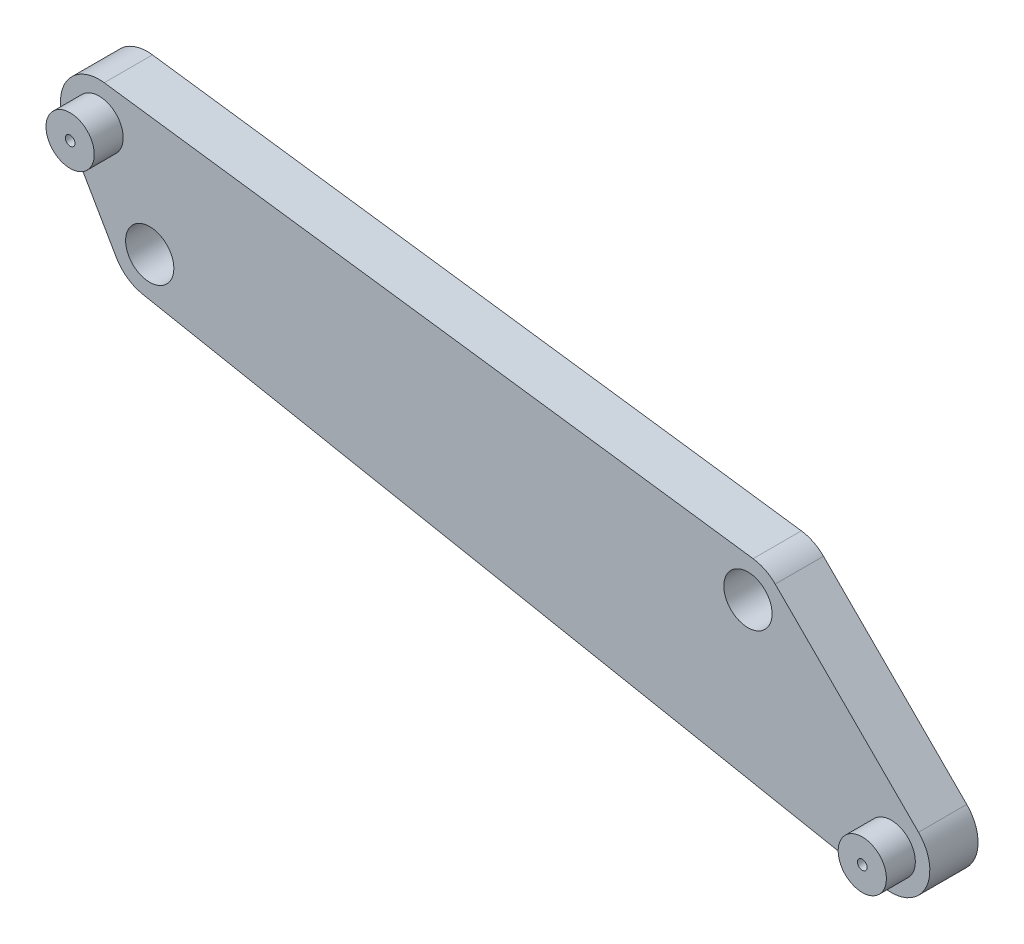
ISO-10303-21;
HEADER;
FILE_DESCRIPTION(('STEP AP214'),'2;1');
FILE_NAME('part.step','',(''),(''),'','','');
FILE_SCHEMA(('AUTOMOTIVE_DESIGN { 1 0 10303 214 1 1 1 1 }'));
ENDSEC;
DATA;
#1=APPLICATION_CONTEXT('core data for automotive mechanical design processes');
#2=APPLICATION_PROTOCOL_DEFINITION('international standard','automotive_design',2000,#1);
#3=PRODUCT_CONTEXT('',#1,'mechanical');
#4=PRODUCT('Part','Part','',(#3));
#5=PRODUCT_RELATED_PRODUCT_CATEGORY('part','',(#4));
#6=PRODUCT_DEFINITION_FORMATION('','',#4);
#7=PRODUCT_DEFINITION_CONTEXT('part definition',#1,'design');
#8=PRODUCT_DEFINITION('design','',#6,#7);
#9=PRODUCT_DEFINITION_SHAPE('','',#8);
#10=(LENGTH_UNIT() NAMED_UNIT(*) SI_UNIT(.MILLI.,.METRE.));
#11=(NAMED_UNIT(*) PLANE_ANGLE_UNIT() SI_UNIT($,.RADIAN.));
#12=(NAMED_UNIT(*) SI_UNIT($,.STERADIAN.) SOLID_ANGLE_UNIT());
#13=UNCERTAINTY_MEASURE_WITH_UNIT(LENGTH_MEASURE(1.E-05),#10,'distance_accuracy_value','');
#14=(GEOMETRIC_REPRESENTATION_CONTEXT(3) GLOBAL_UNCERTAINTY_ASSIGNED_CONTEXT((#13)) GLOBAL_UNIT_ASSIGNED_CONTEXT((#10,
#11,#12)) REPRESENTATION_CONTEXT('',''));
#15=CARTESIAN_POINT('',(0.,0.,0.));
#16=DIRECTION('',(0.,0.,1.));
#17=DIRECTION('',(1.,0.,0.));
#18=AXIS2_PLACEMENT_3D('',#15,#16,#17);
#19=CARTESIAN_POINT('',(-62.,0.,5.));
#20=DIRECTION('',(0.,0.,1.));
#21=DIRECTION('',(1.,0.,0.));
#22=AXIS2_PLACEMENT_3D('',#19,#20,#21);
#23=PLANE('',#22);
#24=CARTESIAN_POINT('',(0.,0.,5.));
#25=DIRECTION('',(0.,0.,1.));
#26=DIRECTION('',(1.,0.,0.));
#27=AXIS2_PLACEMENT_3D('',#24,#25,#26);
#28=CIRCLE('',#27,2.5);
#29=CARTESIAN_POINT('',(2.5,0.,5.));
#30=VERTEX_POINT('',#29);
#31=EDGE_CURVE('E220',#30,#30,#28,.T.);
#32=ORIENTED_EDGE('',*,*,#31,.F.);
#33=EDGE_LOOP('',(#32));
#34=FACE_BOUND('',#33,.T.);
#35=CARTESIAN_POINT('',(-62.,0.,5.));
#36=DIRECTION('',(0.,0.,1.));
#37=DIRECTION('',(1.,0.,0.));
#38=AXIS2_PLACEMENT_3D('',#35,#36,#37);
#39=CIRCLE('',#38,2.5);
#40=CARTESIAN_POINT('',(-59.5,0.,5.));
#41=VERTEX_POINT('',#40);
#42=EDGE_CURVE('E146',#41,#41,#39,.T.);
#43=ORIENTED_EDGE('',*,*,#42,.F.);
#44=EDGE_LOOP('',(#43));
#45=FACE_BOUND('',#44,.T.);
#46=CARTESIAN_POINT('',(-62.,0.,5.));
#47=DIRECTION('',(0.,0.,1.));
#48=DIRECTION('',(1.,0.,0.));
#49=AXIS2_PLACEMENT_3D('',#46,#47,#48);
#50=CIRCLE('',#49,3.99999999999999);
#51=CARTESIAN_POINT('',(-65.4641016151377,-1.99999999999999,5.));
#52=VERTEX_POINT('',#51);
#53=CARTESIAN_POINT('',(-62.7588657347675,-3.92735570028943,5.));
#54=VERTEX_POINT('',#53);
#55=EDGE_CURVE('E164',#52,#54,#50,.T.);
#56=ORIENTED_EDGE('',*,*,#55,.T.);
#57=DIRECTION('',(0.981838925072355,-0.189716433691869,0.));
#58=VECTOR('',#57,1.);
#59=CARTESIAN_POINT('',(14.0903766701501,-18.7765981052068,5.));
#60=LINE('',#59,#58);
#61=CARTESIAN_POINT('',(14.0903766701501,-18.7765981052068,5.));
#62=VERTEX_POINT('',#61);
#63=EDGE_CURVE('E100',#54,#62,#60,.T.);
#64=ORIENTED_EDGE('',*,*,#63,.T.);
#65=CARTESIAN_POINT('',(14.8492424049176,-14.8492424049174,5.));
#66=DIRECTION('',(0.,0.,1.));
#67=DIRECTION('',(1.,0.,0.));
#68=AXIS2_PLACEMENT_3D('',#65,#66,#67);
#69=CIRCLE('',#68,4.);
#70=CARTESIAN_POINT('',(17.6776695296638,-12.0208152801712,5.));
#71=VERTEX_POINT('',#70);
#72=EDGE_CURVE('E185',#62,#71,#69,.T.);
#73=ORIENTED_EDGE('',*,*,#72,.T.);
#74=DIRECTION('',(-0.707106781186551,0.707106781186543,0.));
#75=VECTOR('',#74,1.);
#76=CARTESIAN_POINT('',(2.82842712474617,2.82842712474621,5.));
#77=LINE('',#76,#75);
#78=CARTESIAN_POINT('',(2.82842712474617,2.82842712474621,5.));
#79=VERTEX_POINT('',#78);
#80=EDGE_CURVE('E199',#71,#79,#77,.T.);
#81=ORIENTED_EDGE('',*,*,#80,.T.);
#82=CARTESIAN_POINT('',(0.,0.,5.));
#83=DIRECTION('',(0.,0.,1.));
#84=DIRECTION('',(1.,0.,0.));
#85=AXIS2_PLACEMENT_3D('',#82,#83,#84);
#86=CIRCLE('',#85,4.);
#87=CARTESIAN_POINT('',(0.535985840113661,3.96392724191523,5.));
#88=VERTEX_POINT('',#87);
#89=EDGE_CURVE('E119',#79,#88,#86,.T.);
#90=ORIENTED_EDGE('',*,*,#89,.T.);
#91=DIRECTION('',(-0.990981810478807,0.133996460028415,0.));
#92=VECTOR('',#91,1.);
#93=CARTESIAN_POINT('',(-66.7140141598863,13.0571939816518,5.));
#94=LINE('',#93,#92);
#95=CARTESIAN_POINT('',(-66.7140141598863,13.0571939816518,5.));
#96=VERTEX_POINT('',#95);
#97=EDGE_CURVE('E113',#88,#96,#94,.T.);
#98=ORIENTED_EDGE('',*,*,#97,.T.);
#99=CARTESIAN_POINT('',(-67.25,9.09326673973662,5.));
#100=DIRECTION('',(0.,0.,1.));
#101=DIRECTION('',(1.,0.,0.));
#102=AXIS2_PLACEMENT_3D('',#99,#100,#101);
#103=CIRCLE('',#102,4.);
#104=CARTESIAN_POINT('',(-70.7141016151377,7.09326673973663,5.));
#105=VERTEX_POINT('',#104);
#106=EDGE_CURVE('E117',#96,#105,#103,.T.);
#107=ORIENTED_EDGE('',*,*,#106,.T.);
#108=DIRECTION('',(0.499999999999997,-0.866025403784441,0.));
#109=VECTOR('',#108,1.);
#110=CARTESIAN_POINT('',(-65.4641016151377,-1.99999999999999,5.));
#111=LINE('',#110,#109);
#112=EDGE_CURVE('E57',#105,#52,#111,.T.);
#113=ORIENTED_EDGE('',*,*,#112,.T.);
#114=EDGE_LOOP('',(#56,#64,#73,#81,#90,#98,#107,#113));
#115=FACE_BOUND('',#114,.T.);
#116=CARTESIAN_POINT('',(-67.25,9.09326673973662,5.));
#117=DIRECTION('',(0.,0.,1.));
#118=DIRECTION('',(1.,0.,0.));
#119=AXIS2_PLACEMENT_3D('',#116,#117,#118);
#120=CIRCLE('',#119,2.50000000000001);
#121=CARTESIAN_POINT('',(-64.7499999999999,9.09326673973662,5.));
#122=VERTEX_POINT('',#121);
#123=EDGE_CURVE('E213',#122,#122,#120,.T.);
#124=ORIENTED_EDGE('',*,*,#123,.F.);
#125=EDGE_LOOP('',(#124));
#126=FACE_BOUND('',#125,.T.);
#127=CARTESIAN_POINT('',(14.8492424049176,-14.8492424049174,5.));
#128=DIRECTION('',(0.,0.,1.));
#129=DIRECTION('',(1.,0.,0.));
#130=AXIS2_PLACEMENT_3D('',#127,#128,#129);
#131=CIRCLE('',#130,2.5);
#132=CARTESIAN_POINT('',(17.3492424049176,-14.8492424049174,5.));
#133=VERTEX_POINT('',#132);
#134=EDGE_CURVE('E225',#133,#133,#131,.T.);
#135=ORIENTED_EDGE('',*,*,#134,.F.);
#136=EDGE_LOOP('',(#135));
#137=FACE_BOUND('',#136,.T.);
#138=ADVANCED_FACE('F39',(#34,#45,#115,#126,#137),#23,.T.);
#139=CARTESIAN_POINT('',(-62.,0.,0.));
#140=DIRECTION('',(0.,0.,1.));
#141=DIRECTION('',(1.,0.,0.));
#142=AXIS2_PLACEMENT_3D('',#139,#140,#141);
#143=PLANE('',#142);
#144=CARTESIAN_POINT('',(-62.,0.,0.));
#145=DIRECTION('',(0.,0.,1.));
#146=DIRECTION('',(1.,0.,0.));
#147=AXIS2_PLACEMENT_3D('',#144,#145,#146);
#148=CIRCLE('',#147,3.99999999999999);
#149=CARTESIAN_POINT('',(-65.4641016151377,-1.99999999999999,0.));
#150=VERTEX_POINT('',#149);
#151=CARTESIAN_POINT('',(-62.7588657347675,-3.92735570028943,0.));
#152=VERTEX_POINT('',#151);
#153=EDGE_CURVE('E141',#150,#152,#148,.T.);
#154=ORIENTED_EDGE('',*,*,#153,.F.);
#155=DIRECTION('',(0.499999999999997,-0.866025403784441,0.));
#156=VECTOR('',#155,1.);
#157=CARTESIAN_POINT('',(-65.4641016151377,-1.99999999999999,0.));
#158=LINE('',#157,#156);
#159=CARTESIAN_POINT('',(-70.7141016151377,7.09326673973663,0.));
#160=VERTEX_POINT('',#159);
#161=EDGE_CURVE('E92',#160,#150,#158,.T.);
#162=ORIENTED_EDGE('',*,*,#161,.F.);
#163=CARTESIAN_POINT('',(-67.25,9.09326673973662,0.));
#164=DIRECTION('',(0.,0.,1.));
#165=DIRECTION('',(1.,0.,0.));
#166=AXIS2_PLACEMENT_3D('',#163,#164,#165);
#167=CIRCLE('',#166,4.);
#168=CARTESIAN_POINT('',(-66.7140141598863,13.0571939816518,0.));
#169=VERTEX_POINT('',#168);
#170=EDGE_CURVE('E86',#169,#160,#167,.T.);
#171=ORIENTED_EDGE('',*,*,#170,.F.);
#172=DIRECTION('',(-0.990981810478807,0.133996460028415,0.));
#173=VECTOR('',#172,1.);
#174=CARTESIAN_POINT('',(-66.7140141598863,13.0571939816518,0.));
#175=LINE('',#174,#173);
#176=CARTESIAN_POINT('',(0.535985840113661,3.96392724191523,0.));
#177=VERTEX_POINT('',#176);
#178=EDGE_CURVE('E128',#177,#169,#175,.T.);
#179=ORIENTED_EDGE('',*,*,#178,.F.);
#180=CARTESIAN_POINT('',(0.,0.,0.));
#181=DIRECTION('',(0.,0.,1.));
#182=DIRECTION('',(1.,0.,0.));
#183=AXIS2_PLACEMENT_3D('',#180,#181,#182);
#184=CIRCLE('',#183,4.);
#185=CARTESIAN_POINT('',(2.82842712474617,2.82842712474621,0.));
#186=VERTEX_POINT('',#185);
#187=EDGE_CURVE('E155',#186,#177,#184,.T.);
#188=ORIENTED_EDGE('',*,*,#187,.F.);
#189=DIRECTION('',(-0.707106781186551,0.707106781186543,0.));
#190=VECTOR('',#189,1.);
#191=CARTESIAN_POINT('',(2.82842712474617,2.82842712474621,0.));
#192=LINE('',#191,#190);
#193=CARTESIAN_POINT('',(17.6776695296638,-12.0208152801712,0.));
#194=VERTEX_POINT('',#193);
#195=EDGE_CURVE('E152',#194,#186,#192,.T.);
#196=ORIENTED_EDGE('',*,*,#195,.F.);
#197=CARTESIAN_POINT('',(14.8492424049176,-14.8492424049174,0.));
#198=DIRECTION('',(0.,0.,1.));
#199=DIRECTION('',(1.,0.,0.));
#200=AXIS2_PLACEMENT_3D('',#197,#198,#199);
#201=CIRCLE('',#200,4.);
#202=CARTESIAN_POINT('',(14.0903766701501,-18.7765981052068,0.));
#203=VERTEX_POINT('',#202);
#204=EDGE_CURVE('E149',#203,#194,#201,.T.);
#205=ORIENTED_EDGE('',*,*,#204,.F.);
#206=DIRECTION('',(0.981838925072355,-0.189716433691869,0.));
#207=VECTOR('',#206,1.);
#208=CARTESIAN_POINT('',(14.0903766701501,-18.7765981052068,0.));
#209=LINE('',#208,#207);
#210=EDGE_CURVE('E145',#152,#203,#209,.T.);
#211=ORIENTED_EDGE('',*,*,#210,.F.);
#212=EDGE_LOOP('',(#154,#162,#171,#179,#188,#196,#205,#211));
#213=FACE_BOUND('',#212,.T.);
#214=CARTESIAN_POINT('',(-62.,0.,0.));
#215=DIRECTION('',(0.,0.,1.));
#216=DIRECTION('',(1.,0.,0.));
#217=AXIS2_PLACEMENT_3D('',#214,#215,#216);
#218=CIRCLE('',#217,2.5);
#219=CARTESIAN_POINT('',(-59.5,0.,0.));
#220=VERTEX_POINT('',#219);
#221=EDGE_CURVE('E209',#220,#220,#218,.T.);
#222=ORIENTED_EDGE('',*,*,#221,.T.);
#223=EDGE_LOOP('',(#222));
#224=FACE_BOUND('',#223,.T.);
#225=CARTESIAN_POINT('',(0.,0.,0.));
#226=DIRECTION('',(0.,0.,1.));
#227=DIRECTION('',(1.,0.,0.));
#228=AXIS2_PLACEMENT_3D('',#225,#226,#227);
#229=CIRCLE('',#228,2.5);
#230=CARTESIAN_POINT('',(2.5,0.,0.));
#231=VERTEX_POINT('',#230);
#232=EDGE_CURVE('E221',#231,#231,#229,.T.);
#233=ORIENTED_EDGE('',*,*,#232,.T.);
#234=EDGE_LOOP('',(#233));
#235=FACE_BOUND('',#234,.T.);
#236=CARTESIAN_POINT('',(-67.25,9.09326673973662,0.));
#237=DIRECTION('',(0.,0.,-1.));
#238=DIRECTION('',(-1.,0.,0.));
#239=AXIS2_PLACEMENT_3D('',#236,#237,#238);
#240=CIRCLE('',#239,0.499999999999999);
#241=CARTESIAN_POINT('',(-67.75,9.09326673973662,0.));
#242=VERTEX_POINT('',#241);
#243=EDGE_CURVE('E237',#242,#242,#240,.T.);
#244=ORIENTED_EDGE('',*,*,#243,.F.);
#245=EDGE_LOOP('',(#244));
#246=FACE_BOUND('',#245,.T.);
#247=CARTESIAN_POINT('',(14.8492424049176,-14.8492424049174,0.));
#248=DIRECTION('',(0.,0.,-1.));
#249=DIRECTION('',(-1.,0.,0.));
#250=AXIS2_PLACEMENT_3D('',#247,#248,#249);
#251=CIRCLE('',#250,0.500000000000001);
#252=CARTESIAN_POINT('',(14.3492424049176,-14.8492424049174,0.));
#253=VERTEX_POINT('',#252);
#254=EDGE_CURVE('E249',#253,#253,#251,.T.);
#255=ORIENTED_EDGE('',*,*,#254,.F.);
#256=EDGE_LOOP('',(#255));
#257=FACE_BOUND('',#256,.T.);
#258=ADVANCED_FACE('F189',(#213,#224,#235,#246,#257),#143,.F.);
#259=CARTESIAN_POINT('',(-62.,0.,5.));
#260=DIRECTION('',(0.,0.,-1.));
#261=DIRECTION('',(-1.,0.,0.));
#262=AXIS2_PLACEMENT_3D('',#259,#260,#261);
#263=CYLINDRICAL_SURFACE('',#262,3.99999999999999);
#264=ORIENTED_EDGE('',*,*,#153,.T.);
#265=DIRECTION('',(0.,0.,-1.));
#266=VECTOR('',#265,1.);
#267=CARTESIAN_POINT('',(-62.7588657347675,-3.92735570028943,5.));
#268=LINE('',#267,#266);
#269=EDGE_CURVE('E11',#54,#152,#268,.T.);
#270=ORIENTED_EDGE('',*,*,#269,.F.);
#271=ORIENTED_EDGE('',*,*,#55,.F.);
#272=DIRECTION('',(0.,0.,-1.));
#273=VECTOR('',#272,1.);
#274=CARTESIAN_POINT('',(-65.4641016151377,-1.99999999999999,5.));
#275=LINE('',#274,#273);
#276=EDGE_CURVE('E137',#52,#150,#275,.T.);
#277=ORIENTED_EDGE('',*,*,#276,.T.);
#278=EDGE_LOOP('',(#264,#270,#271,#277));
#279=FACE_BOUND('',#278,.T.);
#280=ADVANCED_FACE('F41',(#279),#263,.T.);
#281=CARTESIAN_POINT('',(14.0903766701501,-18.7765981052068,5.));
#282=DIRECTION('',(0.189716433691869,0.981838925072355,0.));
#283=DIRECTION('',(-0.981838925072356,0.189716433691869,0.));
#284=AXIS2_PLACEMENT_3D('',#281,#282,#283);
#285=PLANE('',#284);
#286=ORIENTED_EDGE('',*,*,#210,.T.);
#287=DIRECTION('',(0.,0.,-1.));
#288=VECTOR('',#287,1.);
#289=CARTESIAN_POINT('',(14.0903766701501,-18.7765981052068,5.));
#290=LINE('',#289,#288);
#291=EDGE_CURVE('E49',#62,#203,#290,.T.);
#292=ORIENTED_EDGE('',*,*,#291,.F.);
#293=ORIENTED_EDGE('',*,*,#63,.F.);
#294=ORIENTED_EDGE('',*,*,#269,.T.);
#295=EDGE_LOOP('',(#286,#292,#293,#294));
#296=FACE_BOUND('',#295,.T.);
#297=ADVANCED_FACE('F272',(#296),#285,.F.);
#298=CARTESIAN_POINT('',(14.8492424049176,-14.8492424049174,5.));
#299=DIRECTION('',(0.,0.,-1.));
#300=DIRECTION('',(-1.,0.,0.));
#301=AXIS2_PLACEMENT_3D('',#298,#299,#300);
#302=CYLINDRICAL_SURFACE('',#301,4.);
#303=ORIENTED_EDGE('',*,*,#204,.T.);
#304=DIRECTION('',(0.,0.,-1.));
#305=VECTOR('',#304,1.);
#306=CARTESIAN_POINT('',(17.6776695296638,-12.0208152801712,5.));
#307=LINE('',#306,#305);
#308=EDGE_CURVE('E175',#71,#194,#307,.T.);
#309=ORIENTED_EDGE('',*,*,#308,.F.);
#310=ORIENTED_EDGE('',*,*,#72,.F.);
#311=ORIENTED_EDGE('',*,*,#291,.T.);
#312=EDGE_LOOP('',(#303,#309,#310,#311));
#313=FACE_BOUND('',#312,.T.);
#314=ADVANCED_FACE('F183',(#313),#302,.T.);
#315=CARTESIAN_POINT('',(2.82842712474617,2.82842712474621,5.));
#316=DIRECTION('',(-0.707106781186544,-0.707106781186551,0.));
#317=DIRECTION('',(0.707106781186551,-0.707106781186544,0.));
#318=AXIS2_PLACEMENT_3D('',#315,#316,#317);
#319=PLANE('',#318);
#320=ORIENTED_EDGE('',*,*,#195,.T.);
#321=DIRECTION('',(0.,0.,-1.));
#322=VECTOR('',#321,1.);
#323=CARTESIAN_POINT('',(2.82842712474617,2.82842712474621,5.));
#324=LINE('',#323,#322);
#325=EDGE_CURVE('E171',#79,#186,#324,.T.);
#326=ORIENTED_EDGE('',*,*,#325,.F.);
#327=ORIENTED_EDGE('',*,*,#80,.F.);
#328=ORIENTED_EDGE('',*,*,#308,.T.);
#329=EDGE_LOOP('',(#320,#326,#327,#328));
#330=FACE_BOUND('',#329,.T.);
#331=ADVANCED_FACE('F194',(#330),#319,.F.);
#332=CARTESIAN_POINT('',(0.,0.,5.));
#333=DIRECTION('',(0.,0.,-1.));
#334=DIRECTION('',(-1.,0.,0.));
#335=AXIS2_PLACEMENT_3D('',#332,#333,#334);
#336=CYLINDRICAL_SURFACE('',#335,4.);
#337=ORIENTED_EDGE('',*,*,#187,.T.);
#338=DIRECTION('',(0.,0.,-1.));
#339=VECTOR('',#338,1.);
#340=CARTESIAN_POINT('',(0.535985840113661,3.96392724191523,5.));
#341=LINE('',#340,#339);
#342=EDGE_CURVE('E130',#88,#177,#341,.T.);
#343=ORIENTED_EDGE('',*,*,#342,.F.);
#344=ORIENTED_EDGE('',*,*,#89,.F.);
#345=ORIENTED_EDGE('',*,*,#325,.T.);
#346=EDGE_LOOP('',(#337,#343,#344,#345));
#347=FACE_BOUND('',#346,.T.);
#348=ADVANCED_FACE('F197',(#347),#336,.T.);
#349=CARTESIAN_POINT('',(-66.7140141598863,13.0571939816518,5.));
#350=DIRECTION('',(-0.133996460028415,-0.990981810478807,0.));
#351=DIRECTION('',(0.990981810478807,-0.133996460028415,0.));
#352=AXIS2_PLACEMENT_3D('',#349,#350,#351);
#353=PLANE('',#352);
#354=ORIENTED_EDGE('',*,*,#178,.T.);
#355=DIRECTION('',(0.,0.,-1.));
#356=VECTOR('',#355,1.);
#357=CARTESIAN_POINT('',(-66.7140141598863,13.0571939816518,5.));
#358=LINE('',#357,#356);
#359=EDGE_CURVE('E125',#96,#169,#358,.T.);
#360=ORIENTED_EDGE('',*,*,#359,.F.);
#361=ORIENTED_EDGE('',*,*,#97,.F.);
#362=ORIENTED_EDGE('',*,*,#342,.T.);
#363=EDGE_LOOP('',(#354,#360,#361,#362));
#364=FACE_BOUND('',#363,.T.);
#365=ADVANCED_FACE('F126',(#364),#353,.F.);
#366=CARTESIAN_POINT('',(-67.25,9.09326673973662,5.));
#367=DIRECTION('',(0.,0.,-1.));
#368=DIRECTION('',(-1.,0.,0.));
#369=AXIS2_PLACEMENT_3D('',#366,#367,#368);
#370=CYLINDRICAL_SURFACE('',#369,4.);
#371=ORIENTED_EDGE('',*,*,#170,.T.);
#372=DIRECTION('',(0.,0.,-1.));
#373=VECTOR('',#372,1.);
#374=CARTESIAN_POINT('',(-70.7141016151377,7.09326673973663,5.));
#375=LINE('',#374,#373);
#376=EDGE_CURVE('E131',#105,#160,#375,.T.);
#377=ORIENTED_EDGE('',*,*,#376,.F.);
#378=ORIENTED_EDGE('',*,*,#106,.F.);
#379=ORIENTED_EDGE('',*,*,#359,.T.);
#380=EDGE_LOOP('',(#371,#377,#378,#379));
#381=FACE_BOUND('',#380,.T.);
#382=ADVANCED_FACE('F133',(#381),#370,.T.);
#383=CARTESIAN_POINT('',(-65.4641016151377,-1.99999999999999,5.));
#384=DIRECTION('',(0.866025403784441,0.499999999999997,0.));
#385=DIRECTION('',(-0.499999999999997,0.866025403784441,0.));
#386=AXIS2_PLACEMENT_3D('',#383,#384,#385);
#387=PLANE('',#386);
#388=ORIENTED_EDGE('',*,*,#161,.T.);
#389=ORIENTED_EDGE('',*,*,#276,.F.);
#390=ORIENTED_EDGE('',*,*,#112,.F.);
#391=ORIENTED_EDGE('',*,*,#376,.T.);
#392=EDGE_LOOP('',(#388,#389,#390,#391));
#393=FACE_BOUND('',#392,.T.);
#394=ADVANCED_FACE('F278',(#393),#387,.F.);
#395=CARTESIAN_POINT('',(-62.,0.,5.));
#396=DIRECTION('',(0.,0.,-1.));
#397=DIRECTION('',(-1.,0.,0.));
#398=AXIS2_PLACEMENT_3D('',#395,#396,#397);
#399=CYLINDRICAL_SURFACE('',#398,2.5);
#400=ORIENTED_EDGE('',*,*,#42,.T.);
#401=EDGE_LOOP('',(#400));
#402=FACE_BOUND('',#401,.T.);
#403=ORIENTED_EDGE('',*,*,#221,.F.);
#404=EDGE_LOOP('',(#403));
#405=FACE_BOUND('',#404,.T.);
#406=ADVANCED_FACE('F281',(#402,#405),#399,.F.);
#407=CARTESIAN_POINT('',(0.,0.,5.));
#408=DIRECTION('',(0.,0.,-1.));
#409=DIRECTION('',(-1.,0.,0.));
#410=AXIS2_PLACEMENT_3D('',#407,#408,#409);
#411=CYLINDRICAL_SURFACE('',#410,2.5);
#412=ORIENTED_EDGE('',*,*,#31,.T.);
#413=EDGE_LOOP('',(#412));
#414=FACE_BOUND('',#413,.T.);
#415=ORIENTED_EDGE('',*,*,#232,.F.);
#416=EDGE_LOOP('',(#415));
#417=FACE_BOUND('',#416,.T.);
#418=ADVANCED_FACE('F328',(#414,#417),#411,.F.);
#419=CARTESIAN_POINT('',(-67.25,9.09326673973662,8.));
#420=DIRECTION('',(0.,0.,-1.));
#421=DIRECTION('',(-1.,0.,0.));
#422=AXIS2_PLACEMENT_3D('',#419,#420,#421);
#423=CYLINDRICAL_SURFACE('',#422,2.50000000000001);
#424=ORIENTED_EDGE('',*,*,#123,.T.);
#425=EDGE_LOOP('',(#424));
#426=FACE_BOUND('',#425,.T.);
#427=CARTESIAN_POINT('',(-67.25,9.09326673973662,8.));
#428=DIRECTION('',(0.,0.,-1.));
#429=DIRECTION('',(-1.,0.,0.));
#430=AXIS2_PLACEMENT_3D('',#427,#428,#429);
#431=CIRCLE('',#430,2.50000000000001);
#432=CARTESIAN_POINT('',(-69.75,9.09326673973662,8.));
#433=VERTEX_POINT('',#432);
#434=EDGE_CURVE('E232',#433,#433,#431,.T.);
#435=ORIENTED_EDGE('',*,*,#434,.T.);
#436=EDGE_LOOP('',(#435));
#437=FACE_BOUND('',#436,.T.);
#438=ADVANCED_FACE('F335',(#426,#437),#423,.T.);
#439=CARTESIAN_POINT('',(-67.25,9.09326673973662,8.));
#440=DIRECTION('',(0.,0.,-1.));
#441=DIRECTION('',(-1.,0.,0.));
#442=AXIS2_PLACEMENT_3D('',#439,#440,#441);
#443=PLANE('',#442);
#444=CARTESIAN_POINT('',(-67.25,9.09326673973662,8.));
#445=DIRECTION('',(0.,0.,-1.));
#446=DIRECTION('',(-1.,0.,0.));
#447=AXIS2_PLACEMENT_3D('',#444,#445,#446);
#448=CIRCLE('',#447,0.499999999999999);
#449=CARTESIAN_POINT('',(-67.75,9.09326673973662,8.));
#450=VERTEX_POINT('',#449);
#451=EDGE_CURVE('E236',#450,#450,#448,.T.);
#452=ORIENTED_EDGE('',*,*,#451,.T.);
#453=EDGE_LOOP('',(#452));
#454=FACE_BOUND('',#453,.T.);
#455=ORIENTED_EDGE('',*,*,#434,.F.);
#456=EDGE_LOOP('',(#455));
#457=FACE_BOUND('',#456,.T.);
#458=ADVANCED_FACE('F343',(#454,#457),#443,.F.);
#459=CARTESIAN_POINT('',(-67.25,9.09326673973662,8.));
#460=DIRECTION('',(0.,0.,-1.));
#461=DIRECTION('',(-1.,0.,0.));
#462=AXIS2_PLACEMENT_3D('',#459,#460,#461);
#463=CYLINDRICAL_SURFACE('',#462,0.499999999999999);
#464=ORIENTED_EDGE('',*,*,#451,.F.);
#465=EDGE_LOOP('',(#464));
#466=FACE_BOUND('',#465,.T.);
#467=ORIENTED_EDGE('',*,*,#243,.T.);
#468=EDGE_LOOP('',(#467));
#469=FACE_BOUND('',#468,.T.);
#470=ADVANCED_FACE('F351',(#466,#469),#463,.F.);
#471=CARTESIAN_POINT('',(14.8492424049176,-14.8492424049174,8.));
#472=DIRECTION('',(0.,0.,-1.));
#473=DIRECTION('',(-1.,0.,0.));
#474=AXIS2_PLACEMENT_3D('',#471,#472,#473);
#475=CYLINDRICAL_SURFACE('',#474,2.5);
#476=ORIENTED_EDGE('',*,*,#134,.T.);
#477=EDGE_LOOP('',(#476));
#478=FACE_BOUND('',#477,.T.);
#479=CARTESIAN_POINT('',(14.8492424049176,-14.8492424049174,8.));
#480=DIRECTION('',(0.,0.,-1.));
#481=DIRECTION('',(-1.,0.,0.));
#482=AXIS2_PLACEMENT_3D('',#479,#480,#481);
#483=CIRCLE('',#482,2.5);
#484=CARTESIAN_POINT('',(12.3492424049176,-14.8492424049174,8.));
#485=VERTEX_POINT('',#484);
#486=EDGE_CURVE('E241',#485,#485,#483,.T.);
#487=ORIENTED_EDGE('',*,*,#486,.T.);
#488=EDGE_LOOP('',(#487));
#489=FACE_BOUND('',#488,.T.);
#490=ADVANCED_FACE('F359',(#478,#489),#475,.T.);
#491=CARTESIAN_POINT('',(14.8492424049176,-14.8492424049174,8.));
#492=DIRECTION('',(0.,0.,-1.));
#493=DIRECTION('',(-1.,0.,0.));
#494=AXIS2_PLACEMENT_3D('',#491,#492,#493);
#495=PLANE('',#494);
#496=CARTESIAN_POINT('',(14.8492424049176,-14.8492424049174,8.));
#497=DIRECTION('',(0.,0.,-1.));
#498=DIRECTION('',(-1.,0.,0.));
#499=AXIS2_PLACEMENT_3D('',#496,#497,#498);
#500=CIRCLE('',#499,0.500000000000001);
#501=CARTESIAN_POINT('',(14.3492424049176,-14.8492424049174,8.));
#502=VERTEX_POINT('',#501);
#503=EDGE_CURVE('E248',#502,#502,#500,.T.);
#504=ORIENTED_EDGE('',*,*,#503,.T.);
#505=EDGE_LOOP('',(#504));
#506=FACE_BOUND('',#505,.T.);
#507=ORIENTED_EDGE('',*,*,#486,.F.);
#508=EDGE_LOOP('',(#507));
#509=FACE_BOUND('',#508,.T.);
#510=ADVANCED_FACE('F257',(#506,#509),#495,.F.);
#511=CARTESIAN_POINT('',(14.8492424049176,-14.8492424049174,8.));
#512=DIRECTION('',(0.,0.,-1.));
#513=DIRECTION('',(-1.,0.,0.));
#514=AXIS2_PLACEMENT_3D('',#511,#512,#513);
#515=CYLINDRICAL_SURFACE('',#514,0.500000000000001);
#516=ORIENTED_EDGE('',*,*,#503,.F.);
#517=EDGE_LOOP('',(#516));
#518=FACE_BOUND('',#517,.T.);
#519=ORIENTED_EDGE('',*,*,#254,.T.);
#520=EDGE_LOOP('',(#519));
#521=FACE_BOUND('',#520,.T.);
#522=ADVANCED_FACE('F260',(#518,#521),#515,.F.);
#523=CLOSED_SHELL('',(#138,#258,#280,#297,#314,#331,#348,#365,#382,#394,#406,#418,#438,#458,
#470,#490,#510,#522));
#524=MANIFOLD_SOLID_BREP('B2',#523);
#525=ADVANCED_BREP_SHAPE_REPRESENTATION('',(#18,#524),#14);
#526=SHAPE_DEFINITION_REPRESENTATION(#9,#525);
ENDSEC;
END-ISO-10303-21;
